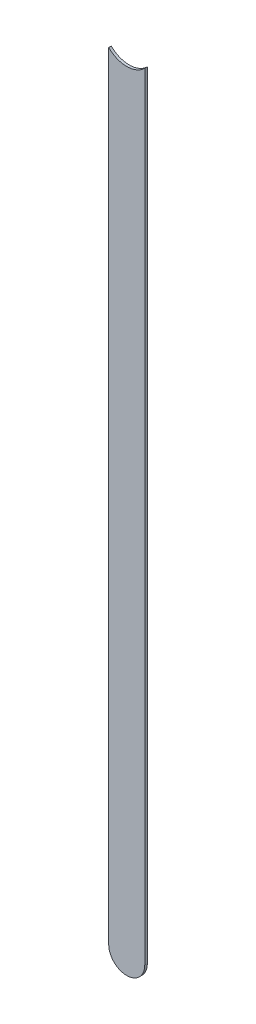
ISO-10303-21;
HEADER;
FILE_DESCRIPTION(('STEP AP214'),'2;1');
FILE_NAME('part.step','',(''),(''),'','','');
FILE_SCHEMA(('AUTOMOTIVE_DESIGN { 1 0 10303 214 1 1 1 1 }'));
ENDSEC;
DATA;
#1=APPLICATION_CONTEXT('core data for automotive mechanical design processes');
#2=APPLICATION_PROTOCOL_DEFINITION('international standard','automotive_design',2000,#1);
#3=PRODUCT_CONTEXT('',#1,'mechanical');
#4=PRODUCT('Part','Part','',(#3));
#5=PRODUCT_RELATED_PRODUCT_CATEGORY('part','',(#4));
#6=PRODUCT_DEFINITION_FORMATION('','',#4);
#7=PRODUCT_DEFINITION_CONTEXT('part definition',#1,'design');
#8=PRODUCT_DEFINITION('design','',#6,#7);
#9=PRODUCT_DEFINITION_SHAPE('','',#8);
#10=(LENGTH_UNIT() NAMED_UNIT(*) SI_UNIT(.MILLI.,.METRE.));
#11=(NAMED_UNIT(*) PLANE_ANGLE_UNIT() SI_UNIT($,.RADIAN.));
#12=(NAMED_UNIT(*) SI_UNIT($,.STERADIAN.) SOLID_ANGLE_UNIT());
#13=UNCERTAINTY_MEASURE_WITH_UNIT(LENGTH_MEASURE(1.E-05),#10,'distance_accuracy_value','');
#14=(GEOMETRIC_REPRESENTATION_CONTEXT(3) GLOBAL_UNCERTAINTY_ASSIGNED_CONTEXT((#13)) GLOBAL_UNIT_ASSIGNED_CONTEXT((#10,
#11,#12)) REPRESENTATION_CONTEXT('',''));
#15=CARTESIAN_POINT('',(0.,0.,0.));
#16=DIRECTION('',(0.,0.,1.));
#17=DIRECTION('',(1.,0.,0.));
#18=AXIS2_PLACEMENT_3D('',#15,#16,#17);
#19=CARTESIAN_POINT('',(58.64999954,84.48002916,0.));
#20=DIRECTION('',(-1.,0.,0.));
#21=DIRECTION('',(0.,1.,0.));
#22=AXIS2_PLACEMENT_3D('',#19,#20,#21);
#23=PLANE('',#22);
#24=DIRECTION('',(0.,1.,0.));
#25=VECTOR('',#24,1.);
#26=CARTESIAN_POINT('',(58.64999954,84.48002916,0.03556));
#27=LINE('',#26,#25);
#28=CARTESIAN_POINT('',(58.64999954,84.48002916,0.03556));
#29=VERTEX_POINT('',#28);
#30=CARTESIAN_POINT('',(58.64999954,95.2471129444069,0.03556));
#31=VERTEX_POINT('',#30);
#32=EDGE_CURVE('E11',#29,#31,#27,.T.);
#33=ORIENTED_EDGE('',*,*,#32,.F.);
#34=DIRECTION('',(0.,0.,1.));
#35=VECTOR('',#34,1.);
#36=CARTESIAN_POINT('',(58.64999954,84.48002916,0.));
#37=LINE('',#36,#35);
#38=CARTESIAN_POINT('',(58.64999954,84.48002916,0.));
#39=VERTEX_POINT('',#38);
#40=EDGE_CURVE('E24',#39,#29,#37,.T.);
#41=ORIENTED_EDGE('',*,*,#40,.F.);
#42=DIRECTION('',(0.,1.,0.));
#43=VECTOR('',#42,1.);
#44=CARTESIAN_POINT('',(58.64999954,84.48002916,0.));
#45=LINE('',#44,#43);
#46=CARTESIAN_POINT('',(58.64999954,95.2471129444069,0.));
#47=VERTEX_POINT('',#46);
#48=EDGE_CURVE('E75',#39,#47,#45,.T.);
#49=ORIENTED_EDGE('',*,*,#48,.T.);
#50=DIRECTION('',(0.,0.,1.));
#51=VECTOR('',#50,1.);
#52=CARTESIAN_POINT('',(58.64999954,95.2471129444069,0.));
#53=LINE('',#52,#51);
#54=EDGE_CURVE('E37',#47,#31,#53,.T.);
#55=ORIENTED_EDGE('',*,*,#54,.T.);
#56=EDGE_LOOP('',(#33,#41,#49,#55));
#57=FACE_BOUND('',#56,.T.);
#58=ADVANCED_FACE('F17',(#57),#23,.F.);
#59=CARTESIAN_POINT('',(58.40000004,95.4999995,0.));
#60=DIRECTION('',(0.,0.,-1.));
#61=DIRECTION('',(1.,0.,0.));
#62=AXIS2_PLACEMENT_3D('',#59,#60,#61);
#63=CYLINDRICAL_SURFACE('',#62,0.3556);
#64=DIRECTION('',(0.,0.,1.));
#65=VECTOR('',#64,1.);
#66=CARTESIAN_POINT('',(58.15000054,95.2471129444069,0.));
#67=LINE('',#66,#65);
#68=CARTESIAN_POINT('',(58.15000054,95.2471129444069,0.));
#69=VERTEX_POINT('',#68);
#70=CARTESIAN_POINT('',(58.15000054,95.2471129444069,0.03556));
#71=VERTEX_POINT('',#70);
#72=EDGE_CURVE('E67',#69,#71,#67,.T.);
#73=ORIENTED_EDGE('',*,*,#72,.T.);
#74=CARTESIAN_POINT('',(58.40000004,95.4999995,0.03556));
#75=DIRECTION('',(0.,0.,1.));
#76=DIRECTION('',(1.,0.,0.));
#77=AXIS2_PLACEMENT_3D('',#74,#75,#76);
#78=CIRCLE('',#77,0.3556);
#79=EDGE_CURVE('E82',#71,#31,#78,.T.);
#80=ORIENTED_EDGE('',*,*,#79,.T.);
#81=ORIENTED_EDGE('',*,*,#54,.F.);
#82=CARTESIAN_POINT('',(58.40000004,95.4999995,0.));
#83=DIRECTION('',(0.,0.,1.));
#84=DIRECTION('',(1.,0.,0.));
#85=AXIS2_PLACEMENT_3D('',#82,#83,#84);
#86=CIRCLE('',#85,0.3556);
#87=EDGE_CURVE('E80',#69,#47,#86,.T.);
#88=ORIENTED_EDGE('',*,*,#87,.F.);
#89=EDGE_LOOP('',(#73,#80,#81,#88));
#90=FACE_BOUND('',#89,.T.);
#91=ADVANCED_FACE('F88',(#90),#63,.F.);
#92=CARTESIAN_POINT('',(58.15000054,95.2471129444069,0.));
#93=DIRECTION('',(1.,0.,0.));
#94=DIRECTION('',(0.,-1.,0.));
#95=AXIS2_PLACEMENT_3D('',#92,#93,#94);
#96=PLANE('',#95);
#97=DIRECTION('',(0.,-1.,0.));
#98=VECTOR('',#97,1.);
#99=CARTESIAN_POINT('',(58.15000054,95.4999995,0.03556));
#100=LINE('',#99,#98);
#101=CARTESIAN_POINT('',(58.15000054,84.48002916,0.03556));
#102=VERTEX_POINT('',#101);
#103=EDGE_CURVE('E71',#71,#102,#100,.T.);
#104=ORIENTED_EDGE('',*,*,#103,.F.);
#105=ORIENTED_EDGE('',*,*,#72,.F.);
#106=DIRECTION('',(0.,-1.,0.));
#107=VECTOR('',#106,1.);
#108=CARTESIAN_POINT('',(58.15000054,95.4999995,0.));
#109=LINE('',#108,#107);
#110=CARTESIAN_POINT('',(58.15000054,84.48002916,0.));
#111=VERTEX_POINT('',#110);
#112=EDGE_CURVE('E63',#69,#111,#109,.T.);
#113=ORIENTED_EDGE('',*,*,#112,.T.);
#114=DIRECTION('',(0.,0.,1.));
#115=VECTOR('',#114,1.);
#116=CARTESIAN_POINT('',(58.15000054,84.48002916,0.));
#117=LINE('',#116,#115);
#118=EDGE_CURVE('E53',#111,#102,#117,.T.);
#119=ORIENTED_EDGE('',*,*,#118,.T.);
#120=EDGE_LOOP('',(#104,#105,#113,#119));
#121=FACE_BOUND('',#120,.T.);
#122=ADVANCED_FACE('F66',(#121),#96,.F.);
#123=CARTESIAN_POINT('',(58.40000004,84.48002916,0.));
#124=DIRECTION('',(0.,0.,-1.));
#125=DIRECTION('',(-1.,0.,0.));
#126=AXIS2_PLACEMENT_3D('',#123,#124,#125);
#127=CYLINDRICAL_SURFACE('',#126,0.249999500000001);
#128=CARTESIAN_POINT('',(58.40000004,84.48002916,0.03556));
#129=DIRECTION('',(0.,0.,1.));
#130=DIRECTION('',(-1.,0.,0.));
#131=AXIS2_PLACEMENT_3D('',#128,#129,#130);
#132=CIRCLE('',#131,0.249999500000001);
#133=EDGE_CURVE('E59',#102,#29,#132,.T.);
#134=ORIENTED_EDGE('',*,*,#133,.F.);
#135=ORIENTED_EDGE('',*,*,#118,.F.);
#136=CARTESIAN_POINT('',(58.40000004,84.48002916,0.));
#137=DIRECTION('',(0.,0.,1.));
#138=DIRECTION('',(-1.,0.,0.));
#139=AXIS2_PLACEMENT_3D('',#136,#137,#138);
#140=CIRCLE('',#139,0.249999500000001);
#141=EDGE_CURVE('E57',#111,#39,#140,.T.);
#142=ORIENTED_EDGE('',*,*,#141,.T.);
#143=ORIENTED_EDGE('',*,*,#40,.T.);
#144=EDGE_LOOP('',(#134,#135,#142,#143));
#145=FACE_BOUND('',#144,.T.);
#146=ADVANCED_FACE('F55',(#145),#127,.T.);
#147=CARTESIAN_POINT('',(58.64999954,84.48002916,0.));
#148=DIRECTION('',(0.,0.,-1.));
#149=DIRECTION('',(-1.,0.,0.));
#150=AXIS2_PLACEMENT_3D('',#147,#148,#149);
#151=PLANE('',#150);
#152=ORIENTED_EDGE('',*,*,#48,.F.);
#153=ORIENTED_EDGE('',*,*,#141,.F.);
#154=ORIENTED_EDGE('',*,*,#112,.F.);
#155=ORIENTED_EDGE('',*,*,#87,.T.);
#156=EDGE_LOOP('',(#152,#153,#154,#155));
#157=FACE_BOUND('',#156,.T.);
#158=ADVANCED_FACE('F74',(#157),#151,.T.);
#159=CARTESIAN_POINT('',(58.64999954,84.48002916,0.03556));
#160=DIRECTION('',(0.,0.,-1.));
#161=DIRECTION('',(-1.,0.,0.));
#162=AXIS2_PLACEMENT_3D('',#159,#160,#161);
#163=PLANE('',#162);
#164=ORIENTED_EDGE('',*,*,#133,.T.);
#165=ORIENTED_EDGE('',*,*,#32,.T.);
#166=ORIENTED_EDGE('',*,*,#79,.F.);
#167=ORIENTED_EDGE('',*,*,#103,.T.);
#168=EDGE_LOOP('',(#164,#165,#166,#167));
#169=FACE_BOUND('',#168,.T.);
#170=ADVANCED_FACE('F91',(#169),#163,.F.);
#171=CLOSED_SHELL('',(#58,#91,#122,#146,#158,#170));
#172=MANIFOLD_SOLID_BREP('B1',#171);
#173=ADVANCED_BREP_SHAPE_REPRESENTATION('',(#18,#172),#14);
#174=SHAPE_DEFINITION_REPRESENTATION(#9,#173);
ENDSEC;
END-ISO-10303-21;
